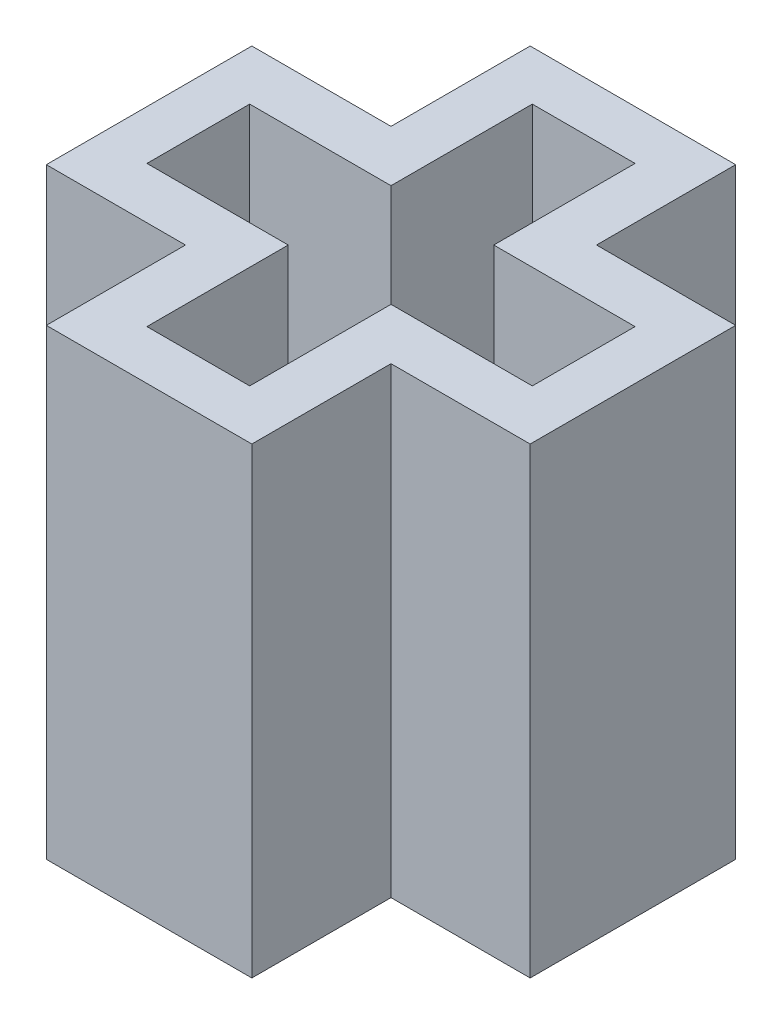
ISO-10303-21;
HEADER;
FILE_DESCRIPTION(('STEP AP214'),'2;1');
FILE_NAME('part.step','',(''),(''),'','','');
FILE_SCHEMA(('AUTOMOTIVE_DESIGN { 1 0 10303 214 1 1 1 1 }'));
ENDSEC;
DATA;
#1=APPLICATION_CONTEXT('core data for automotive mechanical design processes');
#2=APPLICATION_PROTOCOL_DEFINITION('international standard','automotive_design',2000,#1);
#3=PRODUCT_CONTEXT('',#1,'mechanical');
#4=PRODUCT('Part','Part','',(#3));
#5=PRODUCT_RELATED_PRODUCT_CATEGORY('part','',(#4));
#6=PRODUCT_DEFINITION_FORMATION('','',#4);
#7=PRODUCT_DEFINITION_CONTEXT('part definition',#1,'design');
#8=PRODUCT_DEFINITION('design','',#6,#7);
#9=PRODUCT_DEFINITION_SHAPE('','',#8);
#10=(LENGTH_UNIT() NAMED_UNIT(*) SI_UNIT(.MILLI.,.METRE.));
#11=(NAMED_UNIT(*) PLANE_ANGLE_UNIT() SI_UNIT($,.RADIAN.));
#12=(NAMED_UNIT(*) SI_UNIT($,.STERADIAN.) SOLID_ANGLE_UNIT());
#13=UNCERTAINTY_MEASURE_WITH_UNIT(LENGTH_MEASURE(1.E-05),#10,'distance_accuracy_value','');
#14=(GEOMETRIC_REPRESENTATION_CONTEXT(3) GLOBAL_UNCERTAINTY_ASSIGNED_CONTEXT((#13)) GLOBAL_UNIT_ASSIGNED_CONTEXT((#10,
#11,#12)) REPRESENTATION_CONTEXT('',''));
#15=CARTESIAN_POINT('',(0.,0.,0.));
#16=DIRECTION('',(0.,0.,1.));
#17=DIRECTION('',(1.,0.,0.));
#18=AXIS2_PLACEMENT_3D('',#15,#16,#17);
#19=CARTESIAN_POINT('',(0.,5.4,-1.19999999999999));
#20=DIRECTION('',(0.,0.,-1.));
#21=DIRECTION('',(-1.,0.,0.));
#22=AXIS2_PLACEMENT_3D('',#19,#20,#21);
#23=PLANE('',#22);
#24=DIRECTION('',(1.,0.,0.));
#25=VECTOR('',#24,1.);
#26=CARTESIAN_POINT('',(0.,0.,-1.19999999999999));
#27=LINE('',#26,#25);
#28=CARTESIAN_POINT('',(-2.82499999999999,0.,-1.20000000000001));
#29=VERTEX_POINT('',#28);
#30=CARTESIAN_POINT('',(-1.2,0.,-1.20000000000001));
#31=VERTEX_POINT('',#30);
#32=EDGE_CURVE('E291',#29,#31,#27,.T.);
#33=ORIENTED_EDGE('',*,*,#32,.F.);
#34=DIRECTION('',(0.,-1.,0.));
#35=VECTOR('',#34,1.);
#36=CARTESIAN_POINT('',(-2.82499999999999,5.4,-1.20000000000001));
#37=LINE('',#36,#35);
#38=CARTESIAN_POINT('',(-2.82499999999999,5.4,-1.20000000000001));
#39=VERTEX_POINT('',#38);
#40=EDGE_CURVE('E11',#39,#29,#37,.T.);
#41=ORIENTED_EDGE('',*,*,#40,.F.);
#42=DIRECTION('',(1.,0.,0.));
#43=VECTOR('',#42,1.);
#44=CARTESIAN_POINT('',(0.,5.4,-1.19999999999999));
#45=LINE('',#44,#43);
#46=CARTESIAN_POINT('',(-1.2,5.4,-1.20000000000001));
#47=VERTEX_POINT('',#46);
#48=EDGE_CURVE('E457',#39,#47,#45,.T.);
#49=ORIENTED_EDGE('',*,*,#48,.T.);
#50=DIRECTION('',(0.,-1.,0.));
#51=VECTOR('',#50,1.);
#52=CARTESIAN_POINT('',(-1.2,5.4,-1.20000000000001));
#53=LINE('',#52,#51);
#54=EDGE_CURVE('E143',#47,#31,#53,.T.);
#55=ORIENTED_EDGE('',*,*,#54,.T.);
#56=EDGE_LOOP('',(#33,#41,#49,#55));
#57=FACE_BOUND('',#56,.T.);
#58=ADVANCED_FACE('F41',(#57),#23,.T.);
#59=CARTESIAN_POINT('',(-2.825,5.4,0.));
#60=DIRECTION('',(1.,0.,0.));
#61=DIRECTION('',(0.,0.,-1.));
#62=AXIS2_PLACEMENT_3D('',#59,#60,#61);
#63=PLANE('',#62);
#64=DIRECTION('',(0.,0.,1.));
#65=VECTOR('',#64,1.);
#66=CARTESIAN_POINT('',(-2.825,0.,0.));
#67=LINE('',#66,#65);
#68=CARTESIAN_POINT('',(-2.825,0.,1.19999999999999));
#69=VERTEX_POINT('',#68);
#70=EDGE_CURVE('E295',#29,#69,#67,.T.);
#71=ORIENTED_EDGE('',*,*,#70,.T.);
#72=DIRECTION('',(0.,-1.,0.));
#73=VECTOR('',#72,1.);
#74=CARTESIAN_POINT('',(-2.825,5.4,1.19999999999999));
#75=LINE('',#74,#73);
#76=CARTESIAN_POINT('',(-2.825,5.4,1.19999999999999));
#77=VERTEX_POINT('',#76);
#78=EDGE_CURVE('E52',#77,#69,#75,.T.);
#79=ORIENTED_EDGE('',*,*,#78,.F.);
#80=DIRECTION('',(0.,0.,1.));
#81=VECTOR('',#80,1.);
#82=CARTESIAN_POINT('',(-2.825,5.4,0.));
#83=LINE('',#82,#81);
#84=EDGE_CURVE('E460',#39,#77,#83,.T.);
#85=ORIENTED_EDGE('',*,*,#84,.F.);
#86=ORIENTED_EDGE('',*,*,#40,.T.);
#87=EDGE_LOOP('',(#71,#79,#85,#86));
#88=FACE_BOUND('',#87,.T.);
#89=ADVANCED_FACE('F506',(#88),#63,.F.);
#90=CARTESIAN_POINT('',(0.,5.4,1.2));
#91=DIRECTION('',(0.,0.,-1.));
#92=DIRECTION('',(-1.,0.,0.));
#93=AXIS2_PLACEMENT_3D('',#90,#91,#92);
#94=PLANE('',#93);
#95=DIRECTION('',(1.,0.,0.));
#96=VECTOR('',#95,1.);
#97=CARTESIAN_POINT('',(0.,0.,1.2));
#98=LINE('',#97,#96);
#99=CARTESIAN_POINT('',(-1.2,0.,1.19999999999999));
#100=VERTEX_POINT('',#99);
#101=EDGE_CURVE('E299',#69,#100,#98,.T.);
#102=ORIENTED_EDGE('',*,*,#101,.T.);
#103=DIRECTION('',(0.,-1.,0.));
#104=VECTOR('',#103,1.);
#105=CARTESIAN_POINT('',(-1.2,5.4,1.19999999999999));
#106=LINE('',#105,#104);
#107=CARTESIAN_POINT('',(-1.2,5.4,1.19999999999999));
#108=VERTEX_POINT('',#107);
#109=EDGE_CURVE('E358',#108,#100,#106,.T.);
#110=ORIENTED_EDGE('',*,*,#109,.F.);
#111=DIRECTION('',(1.,0.,0.));
#112=VECTOR('',#111,1.);
#113=CARTESIAN_POINT('',(0.,5.4,1.2));
#114=LINE('',#113,#112);
#115=EDGE_CURVE('E464',#77,#108,#114,.T.);
#116=ORIENTED_EDGE('',*,*,#115,.F.);
#117=ORIENTED_EDGE('',*,*,#78,.T.);
#118=EDGE_LOOP('',(#102,#110,#116,#117));
#119=FACE_BOUND('',#118,.T.);
#120=ADVANCED_FACE('F511',(#119),#94,.F.);
#121=CARTESIAN_POINT('',(-1.2,5.4,0.));
#122=DIRECTION('',(-1.,0.,0.));
#123=DIRECTION('',(0.,0.,1.));
#124=AXIS2_PLACEMENT_3D('',#121,#122,#123);
#125=PLANE('',#124);
#126=DIRECTION('',(0.,0.,-1.));
#127=VECTOR('',#126,1.);
#128=CARTESIAN_POINT('',(-1.2,0.,0.));
#129=LINE('',#128,#127);
#130=CARTESIAN_POINT('',(-1.2,0.,2.825));
#131=VERTEX_POINT('',#130);
#132=EDGE_CURVE('E303',#131,#100,#129,.T.);
#133=ORIENTED_EDGE('',*,*,#132,.F.);
#134=DIRECTION('',(0.,-1.,0.));
#135=VECTOR('',#134,1.);
#136=CARTESIAN_POINT('',(-1.2,5.4,2.825));
#137=LINE('',#136,#135);
#138=CARTESIAN_POINT('',(-1.2,5.4,2.825));
#139=VERTEX_POINT('',#138);
#140=EDGE_CURVE('E355',#139,#131,#137,.T.);
#141=ORIENTED_EDGE('',*,*,#140,.F.);
#142=DIRECTION('',(0.,0.,-1.));
#143=VECTOR('',#142,1.);
#144=CARTESIAN_POINT('',(-1.2,5.4,0.));
#145=LINE('',#144,#143);
#146=EDGE_CURVE('E467',#139,#108,#145,.T.);
#147=ORIENTED_EDGE('',*,*,#146,.T.);
#148=ORIENTED_EDGE('',*,*,#109,.T.);
#149=EDGE_LOOP('',(#133,#141,#147,#148));
#150=FACE_BOUND('',#149,.T.);
#151=ADVANCED_FACE('F707',(#150),#125,.T.);
#152=CARTESIAN_POINT('',(0.,5.4,2.825));
#153=DIRECTION('',(0.,0.,-1.));
#154=DIRECTION('',(-1.,0.,0.));
#155=AXIS2_PLACEMENT_3D('',#152,#153,#154);
#156=PLANE('',#155);
#157=DIRECTION('',(1.,0.,0.));
#158=VECTOR('',#157,1.);
#159=CARTESIAN_POINT('',(0.,0.,2.825));
#160=LINE('',#159,#158);
#161=CARTESIAN_POINT('',(1.2,0.,2.825));
#162=VERTEX_POINT('',#161);
#163=EDGE_CURVE('E307',#131,#162,#160,.T.);
#164=ORIENTED_EDGE('',*,*,#163,.T.);
#165=DIRECTION('',(0.,-1.,0.));
#166=VECTOR('',#165,1.);
#167=CARTESIAN_POINT('',(1.2,5.4,2.825));
#168=LINE('',#167,#166);
#169=CARTESIAN_POINT('',(1.2,5.4,2.825));
#170=VERTEX_POINT('',#169);
#171=EDGE_CURVE('E351',#170,#162,#168,.T.);
#172=ORIENTED_EDGE('',*,*,#171,.F.);
#173=DIRECTION('',(1.,0.,0.));
#174=VECTOR('',#173,1.);
#175=CARTESIAN_POINT('',(0.,5.4,2.825));
#176=LINE('',#175,#174);
#177=EDGE_CURVE('E471',#139,#170,#176,.T.);
#178=ORIENTED_EDGE('',*,*,#177,.F.);
#179=ORIENTED_EDGE('',*,*,#140,.T.);
#180=EDGE_LOOP('',(#164,#172,#178,#179));
#181=FACE_BOUND('',#180,.T.);
#182=ADVANCED_FACE('F696',(#181),#156,.F.);
#183=CARTESIAN_POINT('',(1.2,5.4,0.));
#184=DIRECTION('',(-1.,0.,0.));
#185=DIRECTION('',(0.,0.,1.));
#186=AXIS2_PLACEMENT_3D('',#183,#184,#185);
#187=PLANE('',#186);
#188=DIRECTION('',(0.,0.,-1.));
#189=VECTOR('',#188,1.);
#190=CARTESIAN_POINT('',(1.2,0.,0.));
#191=LINE('',#190,#189);
#192=CARTESIAN_POINT('',(1.2,0.,1.2));
#193=VERTEX_POINT('',#192);
#194=EDGE_CURVE('E311',#162,#193,#191,.T.);
#195=ORIENTED_EDGE('',*,*,#194,.T.);
#196=DIRECTION('',(0.,-1.,0.));
#197=VECTOR('',#196,1.);
#198=CARTESIAN_POINT('',(1.2,5.4,1.2));
#199=LINE('',#198,#197);
#200=CARTESIAN_POINT('',(1.2,5.4,1.2));
#201=VERTEX_POINT('',#200);
#202=EDGE_CURVE('E348',#201,#193,#199,.T.);
#203=ORIENTED_EDGE('',*,*,#202,.F.);
#204=DIRECTION('',(0.,0.,-1.));
#205=VECTOR('',#204,1.);
#206=CARTESIAN_POINT('',(1.2,5.4,0.));
#207=LINE('',#206,#205);
#208=EDGE_CURVE('E475',#170,#201,#207,.T.);
#209=ORIENTED_EDGE('',*,*,#208,.F.);
#210=ORIENTED_EDGE('',*,*,#171,.T.);
#211=EDGE_LOOP('',(#195,#203,#209,#210));
#212=FACE_BOUND('',#211,.T.);
#213=ADVANCED_FACE('F686',(#212),#187,.F.);
#214=CARTESIAN_POINT('',(0.,5.4,1.2));
#215=DIRECTION('',(0.,0.,1.));
#216=DIRECTION('',(1.,0.,0.));
#217=AXIS2_PLACEMENT_3D('',#214,#215,#216);
#218=PLANE('',#217);
#219=DIRECTION('',(-1.,0.,0.));
#220=VECTOR('',#219,1.);
#221=CARTESIAN_POINT('',(0.,0.,1.2));
#222=LINE('',#221,#220);
#223=CARTESIAN_POINT('',(2.82499999999999,0.,1.20000000000001));
#224=VERTEX_POINT('',#223);
#225=EDGE_CURVE('E315',#224,#193,#222,.T.);
#226=ORIENTED_EDGE('',*,*,#225,.F.);
#227=DIRECTION('',(0.,-1.,0.));
#228=VECTOR('',#227,1.);
#229=CARTESIAN_POINT('',(2.82499999999999,5.4,1.20000000000001));
#230=LINE('',#229,#228);
#231=CARTESIAN_POINT('',(2.82499999999999,5.4,1.20000000000001));
#232=VERTEX_POINT('',#231);
#233=EDGE_CURVE('E345',#232,#224,#230,.T.);
#234=ORIENTED_EDGE('',*,*,#233,.F.);
#235=DIRECTION('',(-1.,0.,0.));
#236=VECTOR('',#235,1.);
#237=CARTESIAN_POINT('',(0.,5.4,1.2));
#238=LINE('',#237,#236);
#239=EDGE_CURVE('E478',#232,#201,#238,.T.);
#240=ORIENTED_EDGE('',*,*,#239,.T.);
#241=ORIENTED_EDGE('',*,*,#202,.T.);
#242=EDGE_LOOP('',(#226,#234,#240,#241));
#243=FACE_BOUND('',#242,.T.);
#244=ADVANCED_FACE('F493',(#243),#218,.T.);
#245=CARTESIAN_POINT('',(2.825,5.4,0.));
#246=DIRECTION('',(1.,0.,0.));
#247=DIRECTION('',(0.,0.,-1.));
#248=AXIS2_PLACEMENT_3D('',#245,#246,#247);
#249=PLANE('',#248);
#250=DIRECTION('',(0.,0.,1.));
#251=VECTOR('',#250,1.);
#252=CARTESIAN_POINT('',(2.825,0.,0.));
#253=LINE('',#252,#251);
#254=CARTESIAN_POINT('',(2.825,0.,-1.19999999999999));
#255=VERTEX_POINT('',#254);
#256=EDGE_CURVE('E319',#255,#224,#253,.T.);
#257=ORIENTED_EDGE('',*,*,#256,.F.);
#258=DIRECTION('',(0.,-1.,0.));
#259=VECTOR('',#258,1.);
#260=CARTESIAN_POINT('',(2.825,5.4,-1.19999999999999));
#261=LINE('',#260,#259);
#262=CARTESIAN_POINT('',(2.825,5.4,-1.19999999999999));
#263=VERTEX_POINT('',#262);
#264=EDGE_CURVE('E342',#263,#255,#261,.T.);
#265=ORIENTED_EDGE('',*,*,#264,.F.);
#266=DIRECTION('',(0.,0.,1.));
#267=VECTOR('',#266,1.);
#268=CARTESIAN_POINT('',(2.825,5.4,0.));
#269=LINE('',#268,#267);
#270=EDGE_CURVE('E482',#263,#232,#269,.T.);
#271=ORIENTED_EDGE('',*,*,#270,.T.);
#272=ORIENTED_EDGE('',*,*,#233,.T.);
#273=EDGE_LOOP('',(#257,#265,#271,#272));
#274=FACE_BOUND('',#273,.T.);
#275=ADVANCED_FACE('F488',(#274),#249,.T.);
#276=CARTESIAN_POINT('',(0.,5.4,-1.19999999999999));
#277=DIRECTION('',(0.,0.,1.));
#278=DIRECTION('',(1.,0.,0.));
#279=AXIS2_PLACEMENT_3D('',#276,#277,#278);
#280=PLANE('',#279);
#281=DIRECTION('',(-1.,0.,0.));
#282=VECTOR('',#281,1.);
#283=CARTESIAN_POINT('',(0.,0.,-1.19999999999999));
#284=LINE('',#283,#282);
#285=CARTESIAN_POINT('',(1.2,0.,-1.19999999999999));
#286=VERTEX_POINT('',#285);
#287=EDGE_CURVE('E323',#255,#286,#284,.T.);
#288=ORIENTED_EDGE('',*,*,#287,.T.);
#289=DIRECTION('',(0.,-1.,0.));
#290=VECTOR('',#289,1.);
#291=CARTESIAN_POINT('',(1.2,5.4,-1.19999999999999));
#292=LINE('',#291,#290);
#293=CARTESIAN_POINT('',(1.2,5.4,-1.19999999999999));
#294=VERTEX_POINT('',#293);
#295=EDGE_CURVE('E225',#294,#286,#292,.T.);
#296=ORIENTED_EDGE('',*,*,#295,.F.);
#297=DIRECTION('',(-1.,0.,0.));
#298=VECTOR('',#297,1.);
#299=CARTESIAN_POINT('',(0.,5.4,-1.19999999999999));
#300=LINE('',#299,#298);
#301=EDGE_CURVE('E231',#263,#294,#300,.T.);
#302=ORIENTED_EDGE('',*,*,#301,.F.);
#303=ORIENTED_EDGE('',*,*,#264,.T.);
#304=EDGE_LOOP('',(#288,#296,#302,#303));
#305=FACE_BOUND('',#304,.T.);
#306=ADVANCED_FACE('F496',(#305),#280,.F.);
#307=CARTESIAN_POINT('',(1.2,5.4,0.));
#308=DIRECTION('',(1.,0.,0.));
#309=DIRECTION('',(0.,0.,-1.));
#310=AXIS2_PLACEMENT_3D('',#307,#308,#309);
#311=PLANE('',#310);
#312=DIRECTION('',(0.,0.,1.));
#313=VECTOR('',#312,1.);
#314=CARTESIAN_POINT('',(1.2,0.,0.));
#315=LINE('',#314,#313);
#316=CARTESIAN_POINT('',(1.2,0.,-2.825));
#317=VERTEX_POINT('',#316);
#318=EDGE_CURVE('E219',#317,#286,#315,.T.);
#319=ORIENTED_EDGE('',*,*,#318,.F.);
#320=DIRECTION('',(0.,-1.,0.));
#321=VECTOR('',#320,1.);
#322=CARTESIAN_POINT('',(1.2,5.4,-2.825));
#323=LINE('',#322,#321);
#324=CARTESIAN_POINT('',(1.2,5.4,-2.825));
#325=VERTEX_POINT('',#324);
#326=EDGE_CURVE('E214',#325,#317,#323,.T.);
#327=ORIENTED_EDGE('',*,*,#326,.F.);
#328=DIRECTION('',(0.,0.,1.));
#329=VECTOR('',#328,1.);
#330=CARTESIAN_POINT('',(1.2,5.4,0.));
#331=LINE('',#330,#329);
#332=EDGE_CURVE('E217',#325,#294,#331,.T.);
#333=ORIENTED_EDGE('',*,*,#332,.T.);
#334=ORIENTED_EDGE('',*,*,#295,.T.);
#335=EDGE_LOOP('',(#319,#327,#333,#334));
#336=FACE_BOUND('',#335,.T.);
#337=ADVANCED_FACE('F216',(#336),#311,.T.);
#338=CARTESIAN_POINT('',(0.,5.4,-2.825));
#339=DIRECTION('',(0.,0.,-1.));
#340=DIRECTION('',(-1.,0.,0.));
#341=AXIS2_PLACEMENT_3D('',#338,#339,#340);
#342=PLANE('',#341);
#343=DIRECTION('',(1.,0.,0.));
#344=VECTOR('',#343,1.);
#345=CARTESIAN_POINT('',(0.,0.,-2.825));
#346=LINE('',#345,#344);
#347=CARTESIAN_POINT('',(-1.2,0.,-2.825));
#348=VERTEX_POINT('',#347);
#349=EDGE_CURVE('E329',#348,#317,#346,.T.);
#350=ORIENTED_EDGE('',*,*,#349,.F.);
#351=DIRECTION('',(0.,-1.,0.));
#352=VECTOR('',#351,1.);
#353=CARTESIAN_POINT('',(-1.2,5.4,-2.825));
#354=LINE('',#353,#352);
#355=CARTESIAN_POINT('',(-1.2,5.4,-2.825));
#356=VERTEX_POINT('',#355);
#357=EDGE_CURVE('E136',#356,#348,#354,.T.);
#358=ORIENTED_EDGE('',*,*,#357,.F.);
#359=DIRECTION('',(1.,0.,0.));
#360=VECTOR('',#359,1.);
#361=CARTESIAN_POINT('',(0.,5.4,-2.825));
#362=LINE('',#361,#360);
#363=EDGE_CURVE('E228',#356,#325,#362,.T.);
#364=ORIENTED_EDGE('',*,*,#363,.T.);
#365=ORIENTED_EDGE('',*,*,#326,.T.);
#366=EDGE_LOOP('',(#350,#358,#364,#365));
#367=FACE_BOUND('',#366,.T.);
#368=ADVANCED_FACE('F235',(#367),#342,.T.);
#369=CARTESIAN_POINT('',(0.6,5.4,0.));
#370=DIRECTION('',(-1.,0.,0.));
#371=DIRECTION('',(0.,0.,1.));
#372=AXIS2_PLACEMENT_3D('',#369,#370,#371);
#373=PLANE('',#372);
#374=DIRECTION('',(0.,0.,-1.));
#375=VECTOR('',#374,1.);
#376=CARTESIAN_POINT('',(0.6,0.,0.));
#377=LINE('',#376,#375);
#378=CARTESIAN_POINT('',(0.6,0.,-0.6));
#379=VERTEX_POINT('',#378);
#380=CARTESIAN_POINT('',(0.6,0.,-2.25));
#381=VERTEX_POINT('',#380);
#382=EDGE_CURVE('E243',#379,#381,#377,.T.);
#383=ORIENTED_EDGE('',*,*,#382,.F.);
#384=DIRECTION('',(0.,-1.,0.));
#385=VECTOR('',#384,1.);
#386=CARTESIAN_POINT('',(0.6,5.4,-0.6));
#387=LINE('',#386,#385);
#388=CARTESIAN_POINT('',(0.6,5.4,-0.6));
#389=VERTEX_POINT('',#388);
#390=EDGE_CURVE('E45',#389,#379,#387,.T.);
#391=ORIENTED_EDGE('',*,*,#390,.F.);
#392=DIRECTION('',(0.,0.,-1.));
#393=VECTOR('',#392,1.);
#394=CARTESIAN_POINT('',(0.6,5.4,0.));
#395=LINE('',#394,#393);
#396=CARTESIAN_POINT('',(0.6,5.4,-2.25));
#397=VERTEX_POINT('',#396);
#398=EDGE_CURVE('E335',#389,#397,#395,.T.);
#399=ORIENTED_EDGE('',*,*,#398,.T.);
#400=DIRECTION('',(0.,-1.,0.));
#401=VECTOR('',#400,1.);
#402=CARTESIAN_POINT('',(0.6,5.4,-2.25));
#403=LINE('',#402,#401);
#404=EDGE_CURVE('E239',#397,#381,#403,.T.);
#405=ORIENTED_EDGE('',*,*,#404,.T.);
#406=EDGE_LOOP('',(#383,#391,#399,#405));
#407=FACE_BOUND('',#406,.T.);
#408=ADVANCED_FACE('F43',(#407),#373,.T.);
#409=CARTESIAN_POINT('',(0.,5.4,-0.6));
#410=DIRECTION('',(0.,0.,1.));
#411=DIRECTION('',(1.,0.,0.));
#412=AXIS2_PLACEMENT_3D('',#409,#410,#411);
#413=PLANE('',#412);
#414=DIRECTION('',(-1.,0.,0.));
#415=VECTOR('',#414,1.);
#416=CARTESIAN_POINT('',(0.,0.,-0.6));
#417=LINE('',#416,#415);
#418=CARTESIAN_POINT('',(2.25,0.,-0.6));
#419=VERTEX_POINT('',#418);
#420=EDGE_CURVE('E247',#419,#379,#417,.T.);
#421=ORIENTED_EDGE('',*,*,#420,.F.);
#422=DIRECTION('',(0.,-1.,0.));
#423=VECTOR('',#422,1.);
#424=CARTESIAN_POINT('',(2.25,5.4,-0.6));
#425=LINE('',#424,#423);
#426=CARTESIAN_POINT('',(2.25,5.4,-0.6));
#427=VERTEX_POINT('',#426);
#428=EDGE_CURVE('E392',#427,#419,#425,.T.);
#429=ORIENTED_EDGE('',*,*,#428,.F.);
#430=DIRECTION('',(-1.,0.,0.));
#431=VECTOR('',#430,1.);
#432=CARTESIAN_POINT('',(0.,5.4,-0.6));
#433=LINE('',#432,#431);
#434=EDGE_CURVE('E403',#427,#389,#433,.T.);
#435=ORIENTED_EDGE('',*,*,#434,.T.);
#436=ORIENTED_EDGE('',*,*,#390,.T.);
#437=EDGE_LOOP('',(#421,#429,#435,#436));
#438=FACE_BOUND('',#437,.T.);
#439=ADVANCED_FACE('F401',(#438),#413,.T.);
#440=CARTESIAN_POINT('',(2.25,5.4,0.));
#441=DIRECTION('',(-1.,0.,0.));
#442=DIRECTION('',(0.,0.,1.));
#443=AXIS2_PLACEMENT_3D('',#440,#441,#442);
#444=PLANE('',#443);
#445=DIRECTION('',(0.,0.,-1.));
#446=VECTOR('',#445,1.);
#447=CARTESIAN_POINT('',(2.25,0.,0.));
#448=LINE('',#447,#446);
#449=CARTESIAN_POINT('',(2.25,0.,0.6));
#450=VERTEX_POINT('',#449);
#451=EDGE_CURVE('E251',#450,#419,#448,.T.);
#452=ORIENTED_EDGE('',*,*,#451,.F.);
#453=DIRECTION('',(0.,-1.,0.));
#454=VECTOR('',#453,1.);
#455=CARTESIAN_POINT('',(2.25,5.4,0.6));
#456=LINE('',#455,#454);
#457=CARTESIAN_POINT('',(2.25,5.4,0.6));
#458=VERTEX_POINT('',#457);
#459=EDGE_CURVE('E390',#458,#450,#456,.T.);
#460=ORIENTED_EDGE('',*,*,#459,.F.);
#461=DIRECTION('',(0.,0.,-1.));
#462=VECTOR('',#461,1.);
#463=CARTESIAN_POINT('',(2.25,5.4,0.));
#464=LINE('',#463,#462);
#465=EDGE_CURVE('E412',#458,#427,#464,.T.);
#466=ORIENTED_EDGE('',*,*,#465,.T.);
#467=ORIENTED_EDGE('',*,*,#428,.T.);
#468=EDGE_LOOP('',(#452,#460,#466,#467));
#469=FACE_BOUND('',#468,.T.);
#470=ADVANCED_FACE('F410',(#469),#444,.T.);
#471=CARTESIAN_POINT('',(0.,5.4,0.6));
#472=DIRECTION('',(0.,0.,-1.));
#473=DIRECTION('',(-1.,0.,0.));
#474=AXIS2_PLACEMENT_3D('',#471,#472,#473);
#475=PLANE('',#474);
#476=DIRECTION('',(1.,0.,0.));
#477=VECTOR('',#476,1.);
#478=CARTESIAN_POINT('',(0.,0.,0.6));
#479=LINE('',#478,#477);
#480=CARTESIAN_POINT('',(0.6,0.,0.6));
#481=VERTEX_POINT('',#480);
#482=EDGE_CURVE('E255',#481,#450,#479,.T.);
#483=ORIENTED_EDGE('',*,*,#482,.F.);
#484=DIRECTION('',(0.,-1.,0.));
#485=VECTOR('',#484,1.);
#486=CARTESIAN_POINT('',(0.6,5.4,0.6));
#487=LINE('',#486,#485);
#488=CARTESIAN_POINT('',(0.6,5.4,0.6));
#489=VERTEX_POINT('',#488);
#490=EDGE_CURVE('E387',#489,#481,#487,.T.);
#491=ORIENTED_EDGE('',*,*,#490,.F.);
#492=DIRECTION('',(1.,0.,0.));
#493=VECTOR('',#492,1.);
#494=CARTESIAN_POINT('',(0.,5.4,0.6));
#495=LINE('',#494,#493);
#496=EDGE_CURVE('E418',#489,#458,#495,.T.);
#497=ORIENTED_EDGE('',*,*,#496,.T.);
#498=ORIENTED_EDGE('',*,*,#459,.T.);
#499=EDGE_LOOP('',(#483,#491,#497,#498));
#500=FACE_BOUND('',#499,.T.);
#501=ADVANCED_FACE('F422',(#500),#475,.T.);
#502=CARTESIAN_POINT('',(0.6,5.4,0.));
#503=DIRECTION('',(-1.,0.,0.));
#504=DIRECTION('',(0.,0.,1.));
#505=AXIS2_PLACEMENT_3D('',#502,#503,#504);
#506=PLANE('',#505);
#507=DIRECTION('',(0.,0.,-1.));
#508=VECTOR('',#507,1.);
#509=CARTESIAN_POINT('',(0.6,0.,0.));
#510=LINE('',#509,#508);
#511=CARTESIAN_POINT('',(0.6,0.,2.25));
#512=VERTEX_POINT('',#511);
#513=EDGE_CURVE('E259',#512,#481,#510,.T.);
#514=ORIENTED_EDGE('',*,*,#513,.F.);
#515=DIRECTION('',(0.,-1.,0.));
#516=VECTOR('',#515,1.);
#517=CARTESIAN_POINT('',(0.6,5.4,2.25));
#518=LINE('',#517,#516);
#519=CARTESIAN_POINT('',(0.6,5.4,2.25));
#520=VERTEX_POINT('',#519);
#521=EDGE_CURVE('E384',#520,#512,#518,.T.);
#522=ORIENTED_EDGE('',*,*,#521,.F.);
#523=DIRECTION('',(0.,0.,-1.));
#524=VECTOR('',#523,1.);
#525=CARTESIAN_POINT('',(0.6,5.4,0.));
#526=LINE('',#525,#524);
#527=EDGE_CURVE('E424',#520,#489,#526,.T.);
#528=ORIENTED_EDGE('',*,*,#527,.T.);
#529=ORIENTED_EDGE('',*,*,#490,.T.);
#530=EDGE_LOOP('',(#514,#522,#528,#529));
#531=FACE_BOUND('',#530,.T.);
#532=ADVANCED_FACE('F544',(#531),#506,.T.);
#533=CARTESIAN_POINT('',(0.,5.4,2.25));
#534=DIRECTION('',(0.,0.,-1.));
#535=DIRECTION('',(-1.,0.,0.));
#536=AXIS2_PLACEMENT_3D('',#533,#534,#535);
#537=PLANE('',#536);
#538=DIRECTION('',(1.,0.,0.));
#539=VECTOR('',#538,1.);
#540=CARTESIAN_POINT('',(0.,0.,2.25));
#541=LINE('',#540,#539);
#542=CARTESIAN_POINT('',(-0.6,0.,2.25));
#543=VERTEX_POINT('',#542);
#544=EDGE_CURVE('E263',#543,#512,#541,.T.);
#545=ORIENTED_EDGE('',*,*,#544,.F.);
#546=DIRECTION('',(0.,-1.,0.));
#547=VECTOR('',#546,1.);
#548=CARTESIAN_POINT('',(-0.6,5.4,2.25));
#549=LINE('',#548,#547);
#550=CARTESIAN_POINT('',(-0.6,5.4,2.25));
#551=VERTEX_POINT('',#550);
#552=EDGE_CURVE('E381',#551,#543,#549,.T.);
#553=ORIENTED_EDGE('',*,*,#552,.F.);
#554=DIRECTION('',(1.,0.,0.));
#555=VECTOR('',#554,1.);
#556=CARTESIAN_POINT('',(0.,5.4,2.25));
#557=LINE('',#556,#555);
#558=EDGE_CURVE('E427',#551,#520,#557,.T.);
#559=ORIENTED_EDGE('',*,*,#558,.T.);
#560=ORIENTED_EDGE('',*,*,#521,.T.);
#561=EDGE_LOOP('',(#545,#553,#559,#560));
#562=FACE_BOUND('',#561,.T.);
#563=ADVANCED_FACE('F540',(#562),#537,.T.);
#564=CARTESIAN_POINT('',(-0.6,5.4,0.));
#565=DIRECTION('',(1.,0.,0.));
#566=DIRECTION('',(0.,0.,-1.));
#567=AXIS2_PLACEMENT_3D('',#564,#565,#566);
#568=PLANE('',#567);
#569=DIRECTION('',(0.,0.,1.));
#570=VECTOR('',#569,1.);
#571=CARTESIAN_POINT('',(-0.6,0.,0.));
#572=LINE('',#571,#570);
#573=CARTESIAN_POINT('',(-0.6,0.,0.6));
#574=VERTEX_POINT('',#573);
#575=EDGE_CURVE('E267',#574,#543,#572,.T.);
#576=ORIENTED_EDGE('',*,*,#575,.F.);
#577=DIRECTION('',(0.,-1.,0.));
#578=VECTOR('',#577,1.);
#579=CARTESIAN_POINT('',(-0.6,5.4,0.6));
#580=LINE('',#579,#578);
#581=CARTESIAN_POINT('',(-0.6,5.4,0.6));
#582=VERTEX_POINT('',#581);
#583=EDGE_CURVE('E378',#582,#574,#580,.T.);
#584=ORIENTED_EDGE('',*,*,#583,.F.);
#585=DIRECTION('',(0.,0.,1.));
#586=VECTOR('',#585,1.);
#587=CARTESIAN_POINT('',(-0.6,5.4,0.));
#588=LINE('',#587,#586);
#589=EDGE_CURVE('E434',#582,#551,#588,.T.);
#590=ORIENTED_EDGE('',*,*,#589,.T.);
#591=ORIENTED_EDGE('',*,*,#552,.T.);
#592=EDGE_LOOP('',(#576,#584,#590,#591));
#593=FACE_BOUND('',#592,.T.);
#594=ADVANCED_FACE('F536',(#593),#568,.T.);
#595=CARTESIAN_POINT('',(0.,5.4,0.6));
#596=DIRECTION('',(0.,0.,-1.));
#597=DIRECTION('',(-1.,0.,0.));
#598=AXIS2_PLACEMENT_3D('',#595,#596,#597);
#599=PLANE('',#598);
#600=DIRECTION('',(1.,0.,0.));
#601=VECTOR('',#600,1.);
#602=CARTESIAN_POINT('',(0.,0.,0.6));
#603=LINE('',#602,#601);
#604=CARTESIAN_POINT('',(-2.25,0.,0.6));
#605=VERTEX_POINT('',#604);
#606=EDGE_CURVE('E271',#605,#574,#603,.T.);
#607=ORIENTED_EDGE('',*,*,#606,.F.);
#608=DIRECTION('',(0.,-1.,0.));
#609=VECTOR('',#608,1.);
#610=CARTESIAN_POINT('',(-2.25,5.4,0.6));
#611=LINE('',#610,#609);
#612=CARTESIAN_POINT('',(-2.25,5.4,0.6));
#613=VERTEX_POINT('',#612);
#614=EDGE_CURVE('E375',#613,#605,#611,.T.);
#615=ORIENTED_EDGE('',*,*,#614,.F.);
#616=DIRECTION('',(1.,0.,0.));
#617=VECTOR('',#616,1.);
#618=CARTESIAN_POINT('',(0.,5.4,0.6));
#619=LINE('',#618,#617);
#620=EDGE_CURVE('E438',#613,#582,#619,.T.);
#621=ORIENTED_EDGE('',*,*,#620,.T.);
#622=ORIENTED_EDGE('',*,*,#583,.T.);
#623=EDGE_LOOP('',(#607,#615,#621,#622));
#624=FACE_BOUND('',#623,.T.);
#625=ADVANCED_FACE('F532',(#624),#599,.T.);
#626=CARTESIAN_POINT('',(-2.25,5.4,0.));
#627=DIRECTION('',(1.,0.,0.));
#628=DIRECTION('',(0.,0.,-1.));
#629=AXIS2_PLACEMENT_3D('',#626,#627,#628);
#630=PLANE('',#629);
#631=DIRECTION('',(0.,0.,1.));
#632=VECTOR('',#631,1.);
#633=CARTESIAN_POINT('',(-2.25,0.,0.));
#634=LINE('',#633,#632);
#635=CARTESIAN_POINT('',(-2.25,0.,-0.6));
#636=VERTEX_POINT('',#635);
#637=EDGE_CURVE('E275',#636,#605,#634,.T.);
#638=ORIENTED_EDGE('',*,*,#637,.F.);
#639=DIRECTION('',(0.,-1.,0.));
#640=VECTOR('',#639,1.);
#641=CARTESIAN_POINT('',(-2.25,5.4,-0.6));
#642=LINE('',#641,#640);
#643=CARTESIAN_POINT('',(-2.25,5.4,-0.6));
#644=VERTEX_POINT('',#643);
#645=EDGE_CURVE('E372',#644,#636,#642,.T.);
#646=ORIENTED_EDGE('',*,*,#645,.F.);
#647=DIRECTION('',(0.,0.,1.));
#648=VECTOR('',#647,1.);
#649=CARTESIAN_POINT('',(-2.25,5.4,0.));
#650=LINE('',#649,#648);
#651=EDGE_CURVE('E442',#644,#613,#650,.T.);
#652=ORIENTED_EDGE('',*,*,#651,.T.);
#653=ORIENTED_EDGE('',*,*,#614,.T.);
#654=EDGE_LOOP('',(#638,#646,#652,#653));
#655=FACE_BOUND('',#654,.T.);
#656=ADVANCED_FACE('F528',(#655),#630,.T.);
#657=CARTESIAN_POINT('',(0.,5.4,-0.6));
#658=DIRECTION('',(0.,0.,1.));
#659=DIRECTION('',(1.,0.,0.));
#660=AXIS2_PLACEMENT_3D('',#657,#658,#659);
#661=PLANE('',#660);
#662=DIRECTION('',(-1.,0.,0.));
#663=VECTOR('',#662,1.);
#664=CARTESIAN_POINT('',(0.,0.,-0.6));
#665=LINE('',#664,#663);
#666=CARTESIAN_POINT('',(-0.6,0.,-0.6));
#667=VERTEX_POINT('',#666);
#668=EDGE_CURVE('E279',#667,#636,#665,.T.);
#669=ORIENTED_EDGE('',*,*,#668,.F.);
#670=DIRECTION('',(0.,-1.,0.));
#671=VECTOR('',#670,1.);
#672=CARTESIAN_POINT('',(-0.6,5.4,-0.6));
#673=LINE('',#672,#671);
#674=CARTESIAN_POINT('',(-0.6,5.4,-0.6));
#675=VERTEX_POINT('',#674);
#676=EDGE_CURVE('E369',#675,#667,#673,.T.);
#677=ORIENTED_EDGE('',*,*,#676,.F.);
#678=DIRECTION('',(-1.,0.,0.));
#679=VECTOR('',#678,1.);
#680=CARTESIAN_POINT('',(0.,5.4,-0.6));
#681=LINE('',#680,#679);
#682=EDGE_CURVE('E446',#675,#644,#681,.T.);
#683=ORIENTED_EDGE('',*,*,#682,.T.);
#684=ORIENTED_EDGE('',*,*,#645,.T.);
#685=EDGE_LOOP('',(#669,#677,#683,#684));
#686=FACE_BOUND('',#685,.T.);
#687=ADVANCED_FACE('F524',(#686),#661,.T.);
#688=CARTESIAN_POINT('',(-0.6,5.4,0.));
#689=DIRECTION('',(1.,0.,0.));
#690=DIRECTION('',(0.,0.,-1.));
#691=AXIS2_PLACEMENT_3D('',#688,#689,#690);
#692=PLANE('',#691);
#693=DIRECTION('',(0.,0.,1.));
#694=VECTOR('',#693,1.);
#695=CARTESIAN_POINT('',(-0.6,0.,0.));
#696=LINE('',#695,#694);
#697=CARTESIAN_POINT('',(-0.6,0.,-2.25));
#698=VERTEX_POINT('',#697);
#699=EDGE_CURVE('E283',#698,#667,#696,.T.);
#700=ORIENTED_EDGE('',*,*,#699,.F.);
#701=DIRECTION('',(0.,-1.,0.));
#702=VECTOR('',#701,1.);
#703=CARTESIAN_POINT('',(-0.6,5.4,-2.25));
#704=LINE('',#703,#702);
#705=CARTESIAN_POINT('',(-0.6,5.4,-2.25));
#706=VERTEX_POINT('',#705);
#707=EDGE_CURVE('E366',#706,#698,#704,.T.);
#708=ORIENTED_EDGE('',*,*,#707,.F.);
#709=DIRECTION('',(0.,0.,1.));
#710=VECTOR('',#709,1.);
#711=CARTESIAN_POINT('',(-0.6,5.4,0.));
#712=LINE('',#711,#710);
#713=EDGE_CURVE('E450',#706,#675,#712,.T.);
#714=ORIENTED_EDGE('',*,*,#713,.T.);
#715=ORIENTED_EDGE('',*,*,#676,.T.);
#716=EDGE_LOOP('',(#700,#708,#714,#715));
#717=FACE_BOUND('',#716,.T.);
#718=ADVANCED_FACE('F520',(#717),#692,.T.);
#719=CARTESIAN_POINT('',(0.,5.4,-2.25));
#720=DIRECTION('',(0.,0.,-1.));
#721=DIRECTION('',(-1.,0.,0.));
#722=AXIS2_PLACEMENT_3D('',#719,#720,#721);
#723=PLANE('',#722);
#724=DIRECTION('',(1.,0.,0.));
#725=VECTOR('',#724,1.);
#726=CARTESIAN_POINT('',(0.,0.,-2.25));
#727=LINE('',#726,#725);
#728=EDGE_CURVE('E287',#698,#381,#727,.T.);
#729=ORIENTED_EDGE('',*,*,#728,.T.);
#730=ORIENTED_EDGE('',*,*,#404,.F.);
#731=DIRECTION('',(1.,0.,0.));
#732=VECTOR('',#731,1.);
#733=CARTESIAN_POINT('',(0.,5.4,-2.25));
#734=LINE('',#733,#732);
#735=EDGE_CURVE('E454',#706,#397,#734,.T.);
#736=ORIENTED_EDGE('',*,*,#735,.F.);
#737=ORIENTED_EDGE('',*,*,#707,.T.);
#738=EDGE_LOOP('',(#729,#730,#736,#737));
#739=FACE_BOUND('',#738,.T.);
#740=ADVANCED_FACE('F516',(#739),#723,.F.);
#741=CARTESIAN_POINT('',(-1.2,5.4,0.));
#742=DIRECTION('',(1.,0.,0.));
#743=DIRECTION('',(0.,0.,-1.));
#744=AXIS2_PLACEMENT_3D('',#741,#742,#743);
#745=PLANE('',#744);
#746=DIRECTION('',(0.,0.,1.));
#747=VECTOR('',#746,1.);
#748=CARTESIAN_POINT('',(-1.2,0.,0.));
#749=LINE('',#748,#747);
#750=EDGE_CURVE('E332',#348,#31,#749,.T.);
#751=ORIENTED_EDGE('',*,*,#750,.T.);
#752=ORIENTED_EDGE('',*,*,#54,.F.);
#753=DIRECTION('',(0.,0.,1.));
#754=VECTOR('',#753,1.);
#755=CARTESIAN_POINT('',(-1.2,5.4,0.));
#756=LINE('',#755,#754);
#757=EDGE_CURVE('E61',#356,#47,#756,.T.);
#758=ORIENTED_EDGE('',*,*,#757,.F.);
#759=ORIENTED_EDGE('',*,*,#357,.T.);
#760=EDGE_LOOP('',(#751,#752,#758,#759));
#761=FACE_BOUND('',#760,.T.);
#762=ADVANCED_FACE('F519',(#761),#745,.F.);
#763=CARTESIAN_POINT('',(0.,5.4,0.));
#764=DIRECTION('',(0.,1.,0.));
#765=DIRECTION('',(0.,0.,1.));
#766=AXIS2_PLACEMENT_3D('',#763,#764,#765);
#767=PLANE('',#766);
#768=ORIENTED_EDGE('',*,*,#398,.F.);
#769=ORIENTED_EDGE('',*,*,#434,.F.);
#770=ORIENTED_EDGE('',*,*,#465,.F.);
#771=ORIENTED_EDGE('',*,*,#496,.F.);
#772=ORIENTED_EDGE('',*,*,#527,.F.);
#773=ORIENTED_EDGE('',*,*,#558,.F.);
#774=ORIENTED_EDGE('',*,*,#589,.F.);
#775=ORIENTED_EDGE('',*,*,#620,.F.);
#776=ORIENTED_EDGE('',*,*,#651,.F.);
#777=ORIENTED_EDGE('',*,*,#682,.F.);
#778=ORIENTED_EDGE('',*,*,#713,.F.);
#779=ORIENTED_EDGE('',*,*,#735,.T.);
#780=EDGE_LOOP('',(#768,#769,#770,#771,#772,#773,#774,#775,#776,#777,#778,#779));
#781=FACE_BOUND('',#780,.T.);
#782=ORIENTED_EDGE('',*,*,#48,.F.);
#783=ORIENTED_EDGE('',*,*,#84,.T.);
#784=ORIENTED_EDGE('',*,*,#115,.T.);
#785=ORIENTED_EDGE('',*,*,#146,.F.);
#786=ORIENTED_EDGE('',*,*,#177,.T.);
#787=ORIENTED_EDGE('',*,*,#208,.T.);
#788=ORIENTED_EDGE('',*,*,#239,.F.);
#789=ORIENTED_EDGE('',*,*,#270,.F.);
#790=ORIENTED_EDGE('',*,*,#301,.T.);
#791=ORIENTED_EDGE('',*,*,#332,.F.);
#792=ORIENTED_EDGE('',*,*,#363,.F.);
#793=ORIENTED_EDGE('',*,*,#757,.T.);
#794=EDGE_LOOP('',(#782,#783,#784,#785,#786,#787,#788,#789,#790,#791,#792,#793));
#795=FACE_BOUND('',#794,.T.);
#796=ADVANCED_FACE('F227',(#781,#795),#767,.T.);
#797=CARTESIAN_POINT('',(0.,0.,0.));
#798=DIRECTION('',(0.,1.,0.));
#799=DIRECTION('',(0.,0.,1.));
#800=AXIS2_PLACEMENT_3D('',#797,#798,#799);
#801=PLANE('',#800);
#802=ORIENTED_EDGE('',*,*,#382,.T.);
#803=ORIENTED_EDGE('',*,*,#728,.F.);
#804=ORIENTED_EDGE('',*,*,#699,.T.);
#805=ORIENTED_EDGE('',*,*,#668,.T.);
#806=ORIENTED_EDGE('',*,*,#637,.T.);
#807=ORIENTED_EDGE('',*,*,#606,.T.);
#808=ORIENTED_EDGE('',*,*,#575,.T.);
#809=ORIENTED_EDGE('',*,*,#544,.T.);
#810=ORIENTED_EDGE('',*,*,#513,.T.);
#811=ORIENTED_EDGE('',*,*,#482,.T.);
#812=ORIENTED_EDGE('',*,*,#451,.T.);
#813=ORIENTED_EDGE('',*,*,#420,.T.);
#814=EDGE_LOOP('',(#802,#803,#804,#805,#806,#807,#808,#809,#810,#811,#812,#813));
#815=FACE_BOUND('',#814,.T.);
#816=ORIENTED_EDGE('',*,*,#32,.T.);
#817=ORIENTED_EDGE('',*,*,#750,.F.);
#818=ORIENTED_EDGE('',*,*,#349,.T.);
#819=ORIENTED_EDGE('',*,*,#318,.T.);
#820=ORIENTED_EDGE('',*,*,#287,.F.);
#821=ORIENTED_EDGE('',*,*,#256,.T.);
#822=ORIENTED_EDGE('',*,*,#225,.T.);
#823=ORIENTED_EDGE('',*,*,#194,.F.);
#824=ORIENTED_EDGE('',*,*,#163,.F.);
#825=ORIENTED_EDGE('',*,*,#132,.T.);
#826=ORIENTED_EDGE('',*,*,#101,.F.);
#827=ORIENTED_EDGE('',*,*,#70,.F.);
#828=EDGE_LOOP('',(#816,#817,#818,#819,#820,#821,#822,#823,#824,#825,#826,#827));
#829=FACE_BOUND('',#828,.T.);
#830=ADVANCED_FACE('F407',(#815,#829),#801,.F.);
#831=CLOSED_SHELL('',(#58,#89,#120,#151,#182,#213,#244,#275,#306,#337,#368,#408,#439,#470,#501,
#532,#563,#594,#625,#656,#687,#718,#740,#762,#796,#830));
#832=MANIFOLD_SOLID_BREP('B2',#831);
#833=ADVANCED_BREP_SHAPE_REPRESENTATION('',(#18,#832),#14);
#834=SHAPE_DEFINITION_REPRESENTATION(#9,#833);
ENDSEC;
END-ISO-10303-21;
